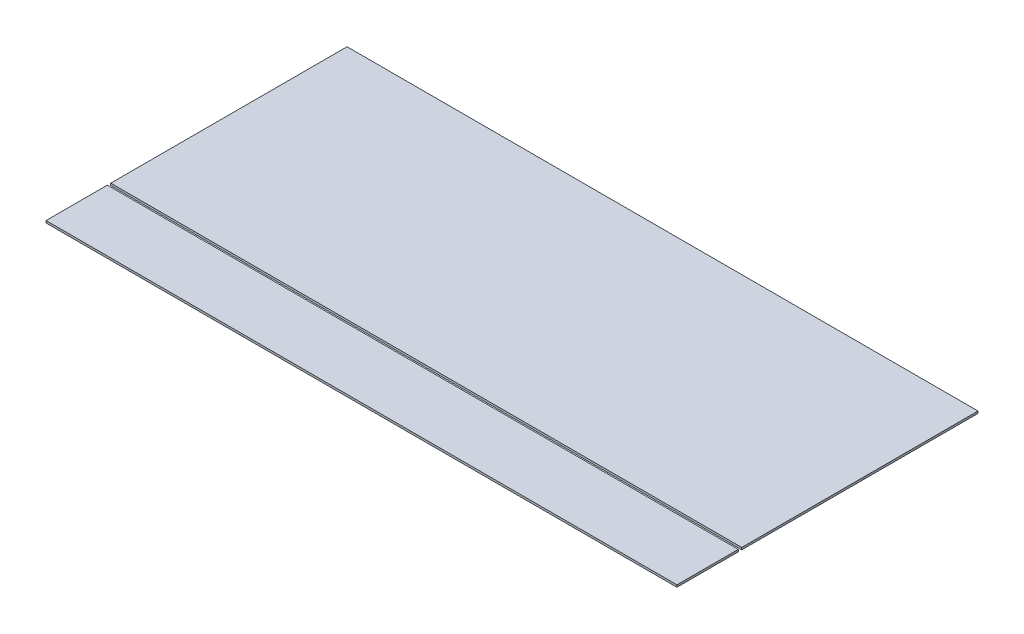
ISO-10303-21;
HEADER;
FILE_DESCRIPTION(('STEP AP214'),'2;1');
FILE_NAME('part.step','',(''),(''),'','','');
FILE_SCHEMA(('AUTOMOTIVE_DESIGN { 1 0 10303 214 1 1 1 1 }'));
ENDSEC;
DATA;
#1=APPLICATION_CONTEXT('core data for automotive mechanical design processes');
#2=APPLICATION_PROTOCOL_DEFINITION('international standard','automotive_design',2000,#1);
#3=PRODUCT_CONTEXT('',#1,'mechanical');
#4=PRODUCT('Part','Part','',(#3));
#5=PRODUCT_RELATED_PRODUCT_CATEGORY('part','',(#4));
#6=PRODUCT_DEFINITION_FORMATION('','',#4);
#7=PRODUCT_DEFINITION_CONTEXT('part definition',#1,'design');
#8=PRODUCT_DEFINITION('design','',#6,#7);
#9=PRODUCT_DEFINITION_SHAPE('','',#8);
#10=(LENGTH_UNIT() NAMED_UNIT(*) SI_UNIT(.MILLI.,.METRE.));
#11=(NAMED_UNIT(*) PLANE_ANGLE_UNIT() SI_UNIT($,.RADIAN.));
#12=(NAMED_UNIT(*) SI_UNIT($,.STERADIAN.) SOLID_ANGLE_UNIT());
#13=UNCERTAINTY_MEASURE_WITH_UNIT(LENGTH_MEASURE(1.E-05),#10,'distance_accuracy_value','');
#14=(GEOMETRIC_REPRESENTATION_CONTEXT(3) GLOBAL_UNCERTAINTY_ASSIGNED_CONTEXT((#13)) GLOBAL_UNIT_ASSIGNED_CONTEXT((#10,
#11,#12)) REPRESENTATION_CONTEXT('',''));
#15=CARTESIAN_POINT('',(0.,0.,0.));
#16=DIRECTION('',(0.,0.,1.));
#17=DIRECTION('',(1.,0.,0.));
#18=AXIS2_PLACEMENT_3D('',#15,#16,#17);
#19=CARTESIAN_POINT('',(0.,-2.5,0.));
#20=DIRECTION('',(0.,-1.,0.));
#21=DIRECTION('',(0.,0.,-1.));
#22=AXIS2_PLACEMENT_3D('',#19,#20,#21);
#23=PLANE('',#22);
#24=DIRECTION('',(0.,0.,-1.));
#25=VECTOR('',#24,1.);
#26=CARTESIAN_POINT('',(742.600000000018,-2.49999999999995,354.3));
#27=LINE('',#26,#25);
#28=CARTESIAN_POINT('',(742.600000000018,-2.49999999999995,354.3));
#29=VERTEX_POINT('',#28);
#30=CARTESIAN_POINT('',(742.600000000018,-2.49999999999995,209.899999999988));
#31=VERTEX_POINT('',#30);
#32=EDGE_CURVE('E105',#29,#31,#27,.T.);
#33=ORIENTED_EDGE('',*,*,#32,.F.);
#34=DIRECTION('',(1.,0.,0.));
#35=VECTOR('',#34,1.);
#36=CARTESIAN_POINT('',(742.600000000018,-2.49999999999995,354.3));
#37=LINE('',#36,#35);
#38=CARTESIAN_POINT('',(-742.599999999975,-2.49999999999995,354.3));
#39=VERTEX_POINT('',#38);
#40=EDGE_CURVE('E97',#39,#29,#37,.T.);
#41=ORIENTED_EDGE('',*,*,#40,.F.);
#42=DIRECTION('',(0.,0.,1.));
#43=VECTOR('',#42,1.);
#44=CARTESIAN_POINT('',(-742.599999999975,-2.49999999999995,354.3));
#45=LINE('',#44,#43);
#46=CARTESIAN_POINT('',(-742.599999999975,-2.49999999999995,209.899999999988));
#47=VERTEX_POINT('',#46);
#48=EDGE_CURVE('E83',#47,#39,#45,.T.);
#49=ORIENTED_EDGE('',*,*,#48,.F.);
#50=DIRECTION('',(-1.,0.,0.));
#51=VECTOR('',#50,1.);
#52=CARTESIAN_POINT('',(742.600000000018,-2.49999999999995,209.899999999988));
#53=LINE('',#52,#51);
#54=EDGE_CURVE('E94',#31,#47,#53,.T.);
#55=ORIENTED_EDGE('',*,*,#54,.F.);
#56=EDGE_LOOP('',(#33,#41,#49,#55));
#57=FACE_BOUND('',#56,.T.);
#58=ADVANCED_FACE('F43',(#57),#23,.T.);
#59=CARTESIAN_POINT('',(742.600000000018,1588.43110821371,354.3));
#60=DIRECTION('',(-1.,0.,0.));
#61=DIRECTION('',(0.,0.,1.));
#62=AXIS2_PLACEMENT_3D('',#59,#60,#61);
#63=PLANE('',#62);
#64=DIRECTION('',(0.,-1.,0.));
#65=VECTOR('',#64,1.);
#66=CARTESIAN_POINT('',(742.600000000018,1588.43110821371,209.899999999988));
#67=LINE('',#66,#65);
#68=CARTESIAN_POINT('',(742.600000000018,2.49999999999995,209.899999999988));
#69=VERTEX_POINT('',#68);
#70=EDGE_CURVE('E100',#69,#31,#67,.T.);
#71=ORIENTED_EDGE('',*,*,#70,.F.);
#72=DIRECTION('',(0.,0.,1.));
#73=VECTOR('',#72,1.);
#74=CARTESIAN_POINT('',(742.600000000018,2.49999999999995,354.3));
#75=LINE('',#74,#73);
#76=CARTESIAN_POINT('',(742.600000000018,2.49999999999995,354.3));
#77=VERTEX_POINT('',#76);
#78=EDGE_CURVE('E59',#69,#77,#75,.T.);
#79=ORIENTED_EDGE('',*,*,#78,.T.);
#80=DIRECTION('',(0.,-1.,0.));
#81=VECTOR('',#80,1.);
#82=CARTESIAN_POINT('',(742.600000000018,1588.43110821371,354.3));
#83=LINE('',#82,#81);
#84=EDGE_CURVE('E102',#77,#29,#83,.T.);
#85=ORIENTED_EDGE('',*,*,#84,.T.);
#86=ORIENTED_EDGE('',*,*,#32,.T.);
#87=EDGE_LOOP('',(#71,#79,#85,#86));
#88=FACE_BOUND('',#87,.T.);
#89=ADVANCED_FACE('F117',(#88),#63,.F.);
#90=CARTESIAN_POINT('',(742.600000000018,1588.43110821371,209.899999999988));
#91=DIRECTION('',(0.,0.,1.));
#92=DIRECTION('',(1.,0.,0.));
#93=AXIS2_PLACEMENT_3D('',#90,#91,#92);
#94=PLANE('',#93);
#95=DIRECTION('',(0.,-1.,0.));
#96=VECTOR('',#95,1.);
#97=CARTESIAN_POINT('',(-742.599999999975,1588.43110821371,209.899999999988));
#98=LINE('',#97,#96);
#99=CARTESIAN_POINT('',(-742.599999999975,2.49999999999995,209.899999999988));
#100=VERTEX_POINT('',#99);
#101=EDGE_CURVE('E79',#100,#47,#98,.T.);
#102=ORIENTED_EDGE('',*,*,#101,.F.);
#103=DIRECTION('',(1.,0.,0.));
#104=VECTOR('',#103,1.);
#105=CARTESIAN_POINT('',(742.600000000018,2.49999999999995,209.899999999988));
#106=LINE('',#105,#104);
#107=EDGE_CURVE('E108',#100,#69,#106,.T.);
#108=ORIENTED_EDGE('',*,*,#107,.T.);
#109=ORIENTED_EDGE('',*,*,#70,.T.);
#110=ORIENTED_EDGE('',*,*,#54,.T.);
#111=EDGE_LOOP('',(#102,#108,#109,#110));
#112=FACE_BOUND('',#111,.T.);
#113=ADVANCED_FACE('F99',(#112),#94,.F.);
#114=CARTESIAN_POINT('',(-742.599999999975,1588.43110821371,354.3));
#115=DIRECTION('',(1.,0.,0.));
#116=DIRECTION('',(0.,0.,-1.));
#117=AXIS2_PLACEMENT_3D('',#114,#115,#116);
#118=PLANE('',#117);
#119=DIRECTION('',(0.,-1.,0.));
#120=VECTOR('',#119,1.);
#121=CARTESIAN_POINT('',(-742.599999999975,1588.43110821371,354.3));
#122=LINE('',#121,#120);
#123=CARTESIAN_POINT('',(-742.599999999975,2.49999999999995,354.3));
#124=VERTEX_POINT('',#123);
#125=EDGE_CURVE('E12',#124,#39,#122,.T.);
#126=ORIENTED_EDGE('',*,*,#125,.F.);
#127=DIRECTION('',(0.,0.,-1.));
#128=VECTOR('',#127,1.);
#129=CARTESIAN_POINT('',(-742.599999999975,2.49999999999995,354.3));
#130=LINE('',#129,#128);
#131=EDGE_CURVE('E85',#124,#100,#130,.T.);
#132=ORIENTED_EDGE('',*,*,#131,.T.);
#133=ORIENTED_EDGE('',*,*,#101,.T.);
#134=ORIENTED_EDGE('',*,*,#48,.T.);
#135=EDGE_LOOP('',(#126,#132,#133,#134));
#136=FACE_BOUND('',#135,.T.);
#137=ADVANCED_FACE('F82',(#136),#118,.F.);
#138=CARTESIAN_POINT('',(742.600000000018,1588.43110821371,354.3));
#139=DIRECTION('',(0.,0.,-1.));
#140=DIRECTION('',(-1.,0.,0.));
#141=AXIS2_PLACEMENT_3D('',#138,#139,#140);
#142=PLANE('',#141);
#143=ORIENTED_EDGE('',*,*,#84,.F.);
#144=DIRECTION('',(-1.,0.,0.));
#145=VECTOR('',#144,1.);
#146=CARTESIAN_POINT('',(742.600000000018,2.49999999999995,354.3));
#147=LINE('',#146,#145);
#148=EDGE_CURVE('E46',#77,#124,#147,.T.);
#149=ORIENTED_EDGE('',*,*,#148,.T.);
#150=ORIENTED_EDGE('',*,*,#125,.T.);
#151=ORIENTED_EDGE('',*,*,#40,.T.);
#152=EDGE_LOOP('',(#143,#149,#150,#151));
#153=FACE_BOUND('',#152,.T.);
#154=ADVANCED_FACE('F115',(#153),#142,.F.);
#155=CARTESIAN_POINT('',(0.,2.5,0.));
#156=DIRECTION('',(0.,-1.,0.));
#157=DIRECTION('',(0.,0.,-1.));
#158=AXIS2_PLACEMENT_3D('',#155,#156,#157);
#159=PLANE('',#158);
#160=ORIENTED_EDGE('',*,*,#107,.F.);
#161=ORIENTED_EDGE('',*,*,#131,.F.);
#162=ORIENTED_EDGE('',*,*,#148,.F.);
#163=ORIENTED_EDGE('',*,*,#78,.F.);
#164=EDGE_LOOP('',(#160,#161,#162,#163));
#165=FACE_BOUND('',#164,.T.);
#166=ADVANCED_FACE('F111',(#165),#159,.F.);
#167=CLOSED_SHELL('',(#58,#89,#113,#137,#154,#166));
#168=MANIFOLD_SOLID_BREP('B2',#167);
#169=CARTESIAN_POINT('',(0.,-2.5,0.));
#170=DIRECTION('',(0.,-1.,0.));
#171=DIRECTION('',(0.,0.,-1.));
#172=AXIS2_PLACEMENT_3D('',#169,#170,#171);
#173=PLANE('',#172);
#174=DIRECTION('',(0.,0.,1.));
#175=VECTOR('',#174,1.);
#176=CARTESIAN_POINT('',(-742.599999999975,-2.49999999999995,-354.3));
#177=LINE('',#176,#175);
#178=CARTESIAN_POINT('',(-742.599999999975,-2.49999999999995,-354.3));
#179=VERTEX_POINT('',#178);
#180=CARTESIAN_POINT('',(-742.599999999975,-2.49999999999995,201.899999999988));
#181=VERTEX_POINT('',#180);
#182=EDGE_CURVE('E235',#179,#181,#177,.T.);
#183=ORIENTED_EDGE('',*,*,#182,.F.);
#184=DIRECTION('',(-1.,0.,0.));
#185=VECTOR('',#184,1.);
#186=CARTESIAN_POINT('',(-742.599999999975,-2.49999999999995,-354.3));
#187=LINE('',#186,#185);
#188=CARTESIAN_POINT('',(742.600000000018,-2.49999999999995,-354.3));
#189=VERTEX_POINT('',#188);
#190=EDGE_CURVE('E227',#189,#179,#187,.T.);
#191=ORIENTED_EDGE('',*,*,#190,.F.);
#192=DIRECTION('',(0.,0.,-1.));
#193=VECTOR('',#192,1.);
#194=CARTESIAN_POINT('',(742.600000000018,-2.49999999999995,-354.3));
#195=LINE('',#194,#193);
#196=CARTESIAN_POINT('',(742.600000000019,-2.49999999999995,201.899999999988));
#197=VERTEX_POINT('',#196);
#198=EDGE_CURVE('E213',#197,#189,#195,.T.);
#199=ORIENTED_EDGE('',*,*,#198,.F.);
#200=DIRECTION('',(1.,0.,0.));
#201=VECTOR('',#200,1.);
#202=CARTESIAN_POINT('',(-742.599999999975,-2.49999999999995,201.899999999988));
#203=LINE('',#202,#201);
#204=EDGE_CURVE('E224',#181,#197,#203,.T.);
#205=ORIENTED_EDGE('',*,*,#204,.F.);
#206=EDGE_LOOP('',(#183,#191,#199,#205));
#207=FACE_BOUND('',#206,.T.);
#208=ADVANCED_FACE('F173',(#207),#173,.T.);
#209=CARTESIAN_POINT('',(-742.599999999975,1588.43110821371,-354.3));
#210=DIRECTION('',(1.,0.,0.));
#211=DIRECTION('',(0.,0.,-1.));
#212=AXIS2_PLACEMENT_3D('',#209,#210,#211);
#213=PLANE('',#212);
#214=DIRECTION('',(0.,-1.,0.));
#215=VECTOR('',#214,1.);
#216=CARTESIAN_POINT('',(-742.599999999975,1588.43110821371,201.899999999988));
#217=LINE('',#216,#215);
#218=CARTESIAN_POINT('',(-742.599999999975,2.49999999999995,201.899999999988));
#219=VERTEX_POINT('',#218);
#220=EDGE_CURVE('E230',#219,#181,#217,.T.);
#221=ORIENTED_EDGE('',*,*,#220,.F.);
#222=DIRECTION('',(0.,0.,-1.));
#223=VECTOR('',#222,1.);
#224=CARTESIAN_POINT('',(-742.599999999975,2.49999999999995,-354.3));
#225=LINE('',#224,#223);
#226=CARTESIAN_POINT('',(-742.599999999975,2.49999999999995,-354.3));
#227=VERTEX_POINT('',#226);
#228=EDGE_CURVE('E189',#219,#227,#225,.T.);
#229=ORIENTED_EDGE('',*,*,#228,.T.);
#230=DIRECTION('',(0.,-1.,0.));
#231=VECTOR('',#230,1.);
#232=CARTESIAN_POINT('',(-742.599999999975,1588.43110821371,-354.3));
#233=LINE('',#232,#231);
#234=EDGE_CURVE('E232',#227,#179,#233,.T.);
#235=ORIENTED_EDGE('',*,*,#234,.T.);
#236=ORIENTED_EDGE('',*,*,#182,.T.);
#237=EDGE_LOOP('',(#221,#229,#235,#236));
#238=FACE_BOUND('',#237,.T.);
#239=ADVANCED_FACE('F247',(#238),#213,.F.);
#240=CARTESIAN_POINT('',(-742.599999999975,1588.43110821371,201.899999999988));
#241=DIRECTION('',(0.,0.,-1.));
#242=DIRECTION('',(-1.,0.,0.));
#243=AXIS2_PLACEMENT_3D('',#240,#241,#242);
#244=PLANE('',#243);
#245=DIRECTION('',(0.,-1.,0.));
#246=VECTOR('',#245,1.);
#247=CARTESIAN_POINT('',(742.600000000019,1588.43110821371,201.899999999988));
#248=LINE('',#247,#246);
#249=CARTESIAN_POINT('',(742.600000000019,2.49999999999995,201.899999999988));
#250=VERTEX_POINT('',#249);
#251=EDGE_CURVE('E209',#250,#197,#248,.T.);
#252=ORIENTED_EDGE('',*,*,#251,.F.);
#253=DIRECTION('',(-1.,0.,0.));
#254=VECTOR('',#253,1.);
#255=CARTESIAN_POINT('',(-742.599999999975,2.49999999999995,201.899999999988));
#256=LINE('',#255,#254);
#257=EDGE_CURVE('E238',#250,#219,#256,.T.);
#258=ORIENTED_EDGE('',*,*,#257,.T.);
#259=ORIENTED_EDGE('',*,*,#220,.T.);
#260=ORIENTED_EDGE('',*,*,#204,.T.);
#261=EDGE_LOOP('',(#252,#258,#259,#260));
#262=FACE_BOUND('',#261,.T.);
#263=ADVANCED_FACE('F229',(#262),#244,.F.);
#264=CARTESIAN_POINT('',(742.600000000018,1588.43110821371,-354.3));
#265=DIRECTION('',(-1.,0.,0.));
#266=DIRECTION('',(0.,0.,1.));
#267=AXIS2_PLACEMENT_3D('',#264,#265,#266);
#268=PLANE('',#267);
#269=DIRECTION('',(0.,-1.,0.));
#270=VECTOR('',#269,1.);
#271=CARTESIAN_POINT('',(742.600000000018,1588.43110821371,-354.3));
#272=LINE('',#271,#270);
#273=CARTESIAN_POINT('',(742.600000000018,2.49999999999995,-354.3));
#274=VERTEX_POINT('',#273);
#275=EDGE_CURVE('E41',#274,#189,#272,.T.);
#276=ORIENTED_EDGE('',*,*,#275,.F.);
#277=DIRECTION('',(0.,0.,1.));
#278=VECTOR('',#277,1.);
#279=CARTESIAN_POINT('',(742.600000000018,2.49999999999995,-354.3));
#280=LINE('',#279,#278);
#281=EDGE_CURVE('E215',#274,#250,#280,.T.);
#282=ORIENTED_EDGE('',*,*,#281,.T.);
#283=ORIENTED_EDGE('',*,*,#251,.T.);
#284=ORIENTED_EDGE('',*,*,#198,.T.);
#285=EDGE_LOOP('',(#276,#282,#283,#284));
#286=FACE_BOUND('',#285,.T.);
#287=ADVANCED_FACE('F212',(#286),#268,.F.);
#288=CARTESIAN_POINT('',(-742.599999999975,1588.43110821371,-354.3));
#289=DIRECTION('',(0.,0.,1.));
#290=DIRECTION('',(1.,0.,0.));
#291=AXIS2_PLACEMENT_3D('',#288,#289,#290);
#292=PLANE('',#291);
#293=ORIENTED_EDGE('',*,*,#234,.F.);
#294=DIRECTION('',(1.,0.,0.));
#295=VECTOR('',#294,1.);
#296=CARTESIAN_POINT('',(-742.599999999975,2.49999999999995,-354.3));
#297=LINE('',#296,#295);
#298=EDGE_CURVE('E176',#227,#274,#297,.T.);
#299=ORIENTED_EDGE('',*,*,#298,.T.);
#300=ORIENTED_EDGE('',*,*,#275,.T.);
#301=ORIENTED_EDGE('',*,*,#190,.T.);
#302=EDGE_LOOP('',(#293,#299,#300,#301));
#303=FACE_BOUND('',#302,.T.);
#304=ADVANCED_FACE('F245',(#303),#292,.F.);
#305=CARTESIAN_POINT('',(0.,2.5,0.));
#306=DIRECTION('',(0.,-1.,0.));
#307=DIRECTION('',(0.,0.,-1.));
#308=AXIS2_PLACEMENT_3D('',#305,#306,#307);
#309=PLANE('',#308);
#310=ORIENTED_EDGE('',*,*,#257,.F.);
#311=ORIENTED_EDGE('',*,*,#281,.F.);
#312=ORIENTED_EDGE('',*,*,#298,.F.);
#313=ORIENTED_EDGE('',*,*,#228,.F.);
#314=EDGE_LOOP('',(#310,#311,#312,#313));
#315=FACE_BOUND('',#314,.T.);
#316=ADVANCED_FACE('F241',(#315),#309,.F.);
#317=CLOSED_SHELL('',(#208,#239,#263,#287,#304,#316));
#318=MANIFOLD_SOLID_BREP('B6',#317);
#319=ADVANCED_BREP_SHAPE_REPRESENTATION('',(#18,#168,#318),#14);
#320=SHAPE_DEFINITION_REPRESENTATION(#9,#319);
ENDSEC;
END-ISO-10303-21;
